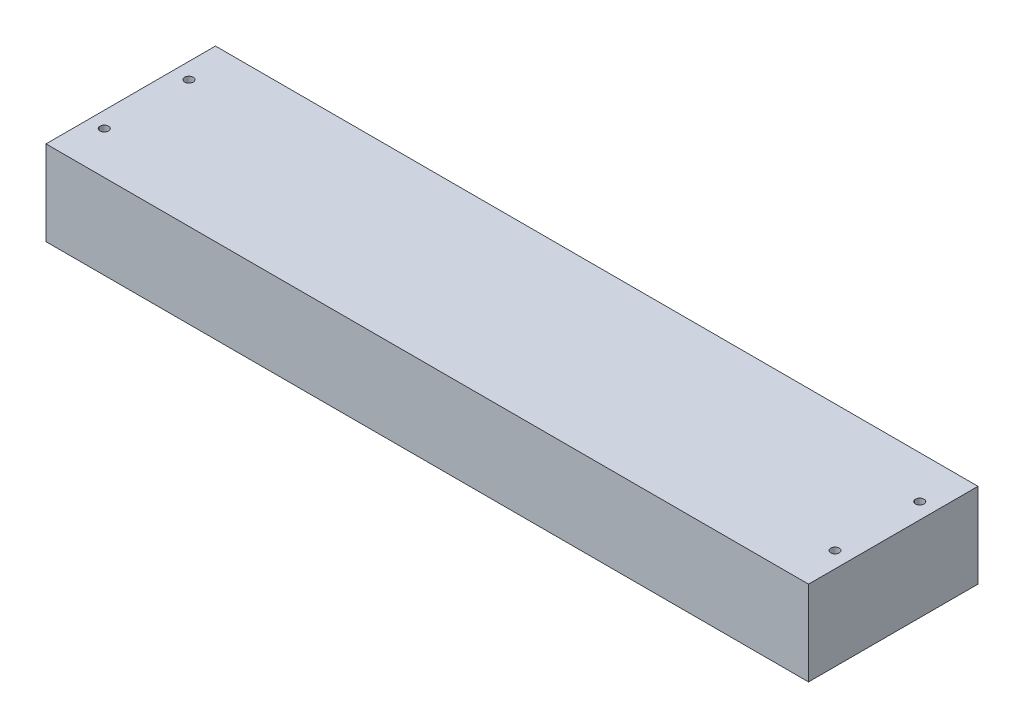
ISO-10303-21;
HEADER;
FILE_DESCRIPTION(('STEP AP214'),'2;1');
FILE_NAME('part.step','',(''),(''),'','','');
FILE_SCHEMA(('AUTOMOTIVE_DESIGN { 1 0 10303 214 1 1 1 1 }'));
ENDSEC;
DATA;
#1=APPLICATION_CONTEXT('core data for automotive mechanical design processes');
#2=APPLICATION_PROTOCOL_DEFINITION('international standard','automotive_design',2000,#1);
#3=PRODUCT_CONTEXT('',#1,'mechanical');
#4=PRODUCT('Part','Part','',(#3));
#5=PRODUCT_RELATED_PRODUCT_CATEGORY('part','',(#4));
#6=PRODUCT_DEFINITION_FORMATION('','',#4);
#7=PRODUCT_DEFINITION_CONTEXT('part definition',#1,'design');
#8=PRODUCT_DEFINITION('design','',#6,#7);
#9=PRODUCT_DEFINITION_SHAPE('','',#8);
#10=(LENGTH_UNIT() NAMED_UNIT(*) SI_UNIT(.MILLI.,.METRE.));
#11=(NAMED_UNIT(*) PLANE_ANGLE_UNIT() SI_UNIT($,.RADIAN.));
#12=(NAMED_UNIT(*) SI_UNIT($,.STERADIAN.) SOLID_ANGLE_UNIT());
#13=UNCERTAINTY_MEASURE_WITH_UNIT(LENGTH_MEASURE(1.E-05),#10,'distance_accuracy_value','');
#14=(GEOMETRIC_REPRESENTATION_CONTEXT(3) GLOBAL_UNCERTAINTY_ASSIGNED_CONTEXT((#13)) GLOBAL_UNIT_ASSIGNED_CONTEXT((#10,
#11,#12)) REPRESENTATION_CONTEXT('',''));
#15=CARTESIAN_POINT('',(0.,0.,0.));
#16=DIRECTION('',(0.,0.,1.));
#17=DIRECTION('',(1.,0.,0.));
#18=AXIS2_PLACEMENT_3D('',#15,#16,#17);
#19=CARTESIAN_POINT('',(457.2,25.4,-50.8));
#20=DIRECTION('',(0.,0.,1.));
#21=DIRECTION('',(1.,0.,0.));
#22=AXIS2_PLACEMENT_3D('',#19,#20,#21);
#23=PLANE('',#22);
#24=DIRECTION('',(0.,1.,0.));
#25=VECTOR('',#24,1.);
#26=CARTESIAN_POINT('',(0.,25.4,-50.8));
#27=LINE('',#26,#25);
#28=CARTESIAN_POINT('',(0.,-25.4,-50.8));
#29=VERTEX_POINT('',#28);
#30=CARTESIAN_POINT('',(0.,25.4,-50.8));
#31=VERTEX_POINT('',#30);
#32=EDGE_CURVE('E99',#29,#31,#27,.T.);
#33=ORIENTED_EDGE('',*,*,#32,.T.);
#34=DIRECTION('',(-1.,0.,0.));
#35=VECTOR('',#34,1.);
#36=CARTESIAN_POINT('',(457.2,25.4,-50.8));
#37=LINE('',#36,#35);
#38=CARTESIAN_POINT('',(457.2,25.4,-50.8));
#39=VERTEX_POINT('',#38);
#40=EDGE_CURVE('E11',#39,#31,#37,.T.);
#41=ORIENTED_EDGE('',*,*,#40,.F.);
#42=DIRECTION('',(0.,1.,0.));
#43=VECTOR('',#42,1.);
#44=CARTESIAN_POINT('',(457.2,25.4,-50.8));
#45=LINE('',#44,#43);
#46=CARTESIAN_POINT('',(457.2,-25.4,-50.8));
#47=VERTEX_POINT('',#46);
#48=EDGE_CURVE('E87',#47,#39,#45,.T.);
#49=ORIENTED_EDGE('',*,*,#48,.F.);
#50=DIRECTION('',(-1.,0.,0.));
#51=VECTOR('',#50,1.);
#52=CARTESIAN_POINT('',(457.2,-25.4,-50.8));
#53=LINE('',#52,#51);
#54=EDGE_CURVE('E95',#47,#29,#53,.T.);
#55=ORIENTED_EDGE('',*,*,#54,.T.);
#56=EDGE_LOOP('',(#33,#41,#49,#55));
#57=FACE_BOUND('',#56,.T.);
#58=ADVANCED_FACE('F36',(#57),#23,.F.);
#59=CARTESIAN_POINT('',(457.2,25.4,50.8));
#60=DIRECTION('',(0.,-1.,0.));
#61=DIRECTION('',(0.,0.,-1.));
#62=AXIS2_PLACEMENT_3D('',#59,#60,#61);
#63=PLANE('',#62);
#64=CARTESIAN_POINT('',(447.675,25.4,-25.4));
#65=DIRECTION('',(0.,-1.,0.));
#66=DIRECTION('',(0.,0.,1.));
#67=AXIS2_PLACEMENT_3D('',#64,#65,#66);
#68=CIRCLE('',#67,2.5527);
#69=CARTESIAN_POINT('',(447.675,25.4,-22.8473));
#70=VERTEX_POINT('',#69);
#71=EDGE_CURVE('E128',#70,#70,#68,.T.);
#72=ORIENTED_EDGE('',*,*,#71,.T.);
#73=EDGE_LOOP('',(#72));
#74=FACE_BOUND('',#73,.T.);
#75=CARTESIAN_POINT('',(447.675,25.4,25.4));
#76=DIRECTION('',(0.,-1.,0.));
#77=DIRECTION('',(0.,0.,1.));
#78=AXIS2_PLACEMENT_3D('',#75,#76,#77);
#79=CIRCLE('',#78,2.5527);
#80=CARTESIAN_POINT('',(447.675,25.4,27.9527));
#81=VERTEX_POINT('',#80);
#82=EDGE_CURVE('E129',#81,#81,#79,.T.);
#83=ORIENTED_EDGE('',*,*,#82,.T.);
#84=EDGE_LOOP('',(#83));
#85=FACE_BOUND('',#84,.T.);
#86=CARTESIAN_POINT('',(9.52500000000001,25.4,-25.4));
#87=DIRECTION('',(0.,1.,0.));
#88=DIRECTION('',(0.,0.,1.));
#89=AXIS2_PLACEMENT_3D('',#86,#87,#88);
#90=CIRCLE('',#89,2.5527);
#91=CARTESIAN_POINT('',(9.52500000000001,25.4,-22.8473));
#92=VERTEX_POINT('',#91);
#93=EDGE_CURVE('E116',#92,#92,#90,.T.);
#94=ORIENTED_EDGE('',*,*,#93,.F.);
#95=EDGE_LOOP('',(#94));
#96=FACE_BOUND('',#95,.T.);
#97=CARTESIAN_POINT('',(9.52500000000001,25.4,25.4));
#98=DIRECTION('',(0.,1.,0.));
#99=DIRECTION('',(0.,0.,1.));
#100=AXIS2_PLACEMENT_3D('',#97,#98,#99);
#101=CIRCLE('',#100,2.5527);
#102=CARTESIAN_POINT('',(9.52500000000001,25.4,27.9527));
#103=VERTEX_POINT('',#102);
#104=EDGE_CURVE('E117',#103,#103,#101,.T.);
#105=ORIENTED_EDGE('',*,*,#104,.F.);
#106=EDGE_LOOP('',(#105));
#107=FACE_BOUND('',#106,.T.);
#108=DIRECTION('',(0.,0.,1.));
#109=VECTOR('',#108,1.);
#110=CARTESIAN_POINT('',(0.,25.4,50.8));
#111=LINE('',#110,#109);
#112=CARTESIAN_POINT('',(0.,25.4,50.8));
#113=VERTEX_POINT('',#112);
#114=EDGE_CURVE('E91',#31,#113,#111,.T.);
#115=ORIENTED_EDGE('',*,*,#114,.T.);
#116=DIRECTION('',(-1.,0.,0.));
#117=VECTOR('',#116,1.);
#118=CARTESIAN_POINT('',(457.2,25.4,50.8));
#119=LINE('',#118,#117);
#120=CARTESIAN_POINT('',(457.2,25.4,50.8));
#121=VERTEX_POINT('',#120);
#122=EDGE_CURVE('E44',#121,#113,#119,.T.);
#123=ORIENTED_EDGE('',*,*,#122,.F.);
#124=DIRECTION('',(0.,0.,1.));
#125=VECTOR('',#124,1.);
#126=CARTESIAN_POINT('',(457.2,25.4,50.8));
#127=LINE('',#126,#125);
#128=EDGE_CURVE('E82',#39,#121,#127,.T.);
#129=ORIENTED_EDGE('',*,*,#128,.F.);
#130=ORIENTED_EDGE('',*,*,#40,.T.);
#131=EDGE_LOOP('',(#115,#123,#129,#130));
#132=FACE_BOUND('',#131,.T.);
#133=ADVANCED_FACE('F90',(#74,#85,#96,#107,#132),#63,.F.);
#134=CARTESIAN_POINT('',(457.2,25.4,50.8));
#135=DIRECTION('',(0.,0.,-1.));
#136=DIRECTION('',(-1.,0.,0.));
#137=AXIS2_PLACEMENT_3D('',#134,#135,#136);
#138=PLANE('',#137);
#139=DIRECTION('',(0.,-1.,0.));
#140=VECTOR('',#139,1.);
#141=CARTESIAN_POINT('',(0.,25.4,50.8));
#142=LINE('',#141,#140);
#143=CARTESIAN_POINT('',(0.,-25.4,50.8));
#144=VERTEX_POINT('',#143);
#145=EDGE_CURVE('E69',#113,#144,#142,.T.);
#146=ORIENTED_EDGE('',*,*,#145,.T.);
#147=DIRECTION('',(-1.,0.,0.));
#148=VECTOR('',#147,1.);
#149=CARTESIAN_POINT('',(457.2,-25.4,50.8));
#150=LINE('',#149,#148);
#151=CARTESIAN_POINT('',(457.2,-25.4,50.8));
#152=VERTEX_POINT('',#151);
#153=EDGE_CURVE('E92',#152,#144,#150,.T.);
#154=ORIENTED_EDGE('',*,*,#153,.F.);
#155=DIRECTION('',(0.,-1.,0.));
#156=VECTOR('',#155,1.);
#157=CARTESIAN_POINT('',(457.2,25.4,50.8));
#158=LINE('',#157,#156);
#159=EDGE_CURVE('E85',#121,#152,#158,.T.);
#160=ORIENTED_EDGE('',*,*,#159,.F.);
#161=ORIENTED_EDGE('',*,*,#122,.T.);
#162=EDGE_LOOP('',(#146,#154,#160,#161));
#163=FACE_BOUND('',#162,.T.);
#164=ADVANCED_FACE('F93',(#163),#138,.F.);
#165=CARTESIAN_POINT('',(457.2,-25.4,50.8));
#166=DIRECTION('',(0.,1.,0.));
#167=DIRECTION('',(0.,0.,1.));
#168=AXIS2_PLACEMENT_3D('',#165,#166,#167);
#169=PLANE('',#168);
#170=CARTESIAN_POINT('',(447.675,-25.4,-25.4));
#171=DIRECTION('',(0.,1.,0.));
#172=DIRECTION('',(0.,0.,1.));
#173=AXIS2_PLACEMENT_3D('',#170,#171,#172);
#174=CIRCLE('',#173,2.5527);
#175=CARTESIAN_POINT('',(447.675,-25.4,-22.8473));
#176=VERTEX_POINT('',#175);
#177=EDGE_CURVE('E120',#176,#176,#174,.T.);
#178=ORIENTED_EDGE('',*,*,#177,.T.);
#179=EDGE_LOOP('',(#178));
#180=FACE_BOUND('',#179,.T.);
#181=CARTESIAN_POINT('',(447.675,-25.4,25.4));
#182=DIRECTION('',(0.,1.,0.));
#183=DIRECTION('',(0.,0.,1.));
#184=AXIS2_PLACEMENT_3D('',#181,#182,#183);
#185=CIRCLE('',#184,2.5527);
#186=CARTESIAN_POINT('',(447.675,-25.4,27.9527));
#187=VERTEX_POINT('',#186);
#188=EDGE_CURVE('E125',#187,#187,#185,.T.);
#189=ORIENTED_EDGE('',*,*,#188,.T.);
#190=EDGE_LOOP('',(#189));
#191=FACE_BOUND('',#190,.T.);
#192=CARTESIAN_POINT('',(9.52500000000001,-25.4,-25.4));
#193=DIRECTION('',(0.,1.,0.));
#194=DIRECTION('',(0.,0.,1.));
#195=AXIS2_PLACEMENT_3D('',#192,#193,#194);
#196=CIRCLE('',#195,2.5527);
#197=CARTESIAN_POINT('',(9.52500000000001,-25.4,-22.8473));
#198=VERTEX_POINT('',#197);
#199=EDGE_CURVE('E102',#198,#198,#196,.F.);
#200=ORIENTED_EDGE('',*,*,#199,.F.);
#201=EDGE_LOOP('',(#200));
#202=FACE_BOUND('',#201,.T.);
#203=CARTESIAN_POINT('',(9.52500000000001,-25.4,25.4));
#204=DIRECTION('',(0.,1.,0.));
#205=DIRECTION('',(0.,0.,1.));
#206=AXIS2_PLACEMENT_3D('',#203,#204,#205);
#207=CIRCLE('',#206,2.5527);
#208=CARTESIAN_POINT('',(9.52500000000001,-25.4,27.9527));
#209=VERTEX_POINT('',#208);
#210=EDGE_CURVE('E113',#209,#209,#207,.F.);
#211=ORIENTED_EDGE('',*,*,#210,.F.);
#212=EDGE_LOOP('',(#211));
#213=FACE_BOUND('',#212,.T.);
#214=DIRECTION('',(0.,0.,-1.));
#215=VECTOR('',#214,1.);
#216=CARTESIAN_POINT('',(0.,-25.4,50.8));
#217=LINE('',#216,#215);
#218=EDGE_CURVE('E75',#144,#29,#217,.T.);
#219=ORIENTED_EDGE('',*,*,#218,.T.);
#220=ORIENTED_EDGE('',*,*,#54,.F.);
#221=DIRECTION('',(0.,0.,-1.));
#222=VECTOR('',#221,1.);
#223=CARTESIAN_POINT('',(457.2,-25.4,50.8));
#224=LINE('',#223,#222);
#225=EDGE_CURVE('E52',#152,#47,#224,.T.);
#226=ORIENTED_EDGE('',*,*,#225,.F.);
#227=ORIENTED_EDGE('',*,*,#153,.T.);
#228=EDGE_LOOP('',(#219,#220,#226,#227));
#229=FACE_BOUND('',#228,.T.);
#230=ADVANCED_FACE('F107',(#180,#191,#202,#213,#229),#169,.F.);
#231=CARTESIAN_POINT('',(457.2,0.,0.));
#232=DIRECTION('',(1.,0.,0.));
#233=DIRECTION('',(0.,0.,-1.));
#234=AXIS2_PLACEMENT_3D('',#231,#232,#233);
#235=PLANE('',#234);
#236=ORIENTED_EDGE('',*,*,#48,.T.);
#237=ORIENTED_EDGE('',*,*,#128,.T.);
#238=ORIENTED_EDGE('',*,*,#159,.T.);
#239=ORIENTED_EDGE('',*,*,#225,.T.);
#240=EDGE_LOOP('',(#236,#237,#238,#239));
#241=FACE_BOUND('',#240,.T.);
#242=ADVANCED_FACE('F83',(#241),#235,.T.);
#243=CARTESIAN_POINT('',(0.,0.,0.));
#244=DIRECTION('',(1.,0.,0.));
#245=DIRECTION('',(0.,0.,-1.));
#246=AXIS2_PLACEMENT_3D('',#243,#244,#245);
#247=PLANE('',#246);
#248=ORIENTED_EDGE('',*,*,#32,.F.);
#249=ORIENTED_EDGE('',*,*,#218,.F.);
#250=ORIENTED_EDGE('',*,*,#145,.F.);
#251=ORIENTED_EDGE('',*,*,#114,.F.);
#252=EDGE_LOOP('',(#248,#249,#250,#251));
#253=FACE_BOUND('',#252,.T.);
#254=ADVANCED_FACE('F110',(#253),#247,.F.);
#255=CARTESIAN_POINT('',(9.52500000000001,-32.6201259213396,25.4));
#256=DIRECTION('',(0.,1.,0.));
#257=DIRECTION('',(0.,0.,1.));
#258=AXIS2_PLACEMENT_3D('',#255,#256,#257);
#259=CYLINDRICAL_SURFACE('',#258,2.5527);
#260=ORIENTED_EDGE('',*,*,#210,.T.);
#261=EDGE_LOOP('',(#260));
#262=FACE_BOUND('',#261,.T.);
#263=ORIENTED_EDGE('',*,*,#104,.T.);
#264=EDGE_LOOP('',(#263));
#265=FACE_BOUND('',#264,.T.);
#266=ADVANCED_FACE('F165',(#262,#265),#259,.F.);
#267=CARTESIAN_POINT('',(9.52500000000001,-32.6201259213396,-25.4));
#268=DIRECTION('',(0.,1.,0.));
#269=DIRECTION('',(0.,0.,1.));
#270=AXIS2_PLACEMENT_3D('',#267,#268,#269);
#271=CYLINDRICAL_SURFACE('',#270,2.5527);
#272=ORIENTED_EDGE('',*,*,#199,.T.);
#273=EDGE_LOOP('',(#272));
#274=FACE_BOUND('',#273,.T.);
#275=ORIENTED_EDGE('',*,*,#93,.T.);
#276=EDGE_LOOP('',(#275));
#277=FACE_BOUND('',#276,.T.);
#278=ADVANCED_FACE('F147',(#274,#277),#271,.F.);
#279=CARTESIAN_POINT('',(447.675,-32.6201259213396,25.4));
#280=DIRECTION('',(0.,1.,0.));
#281=DIRECTION('',(0.,0.,1.));
#282=AXIS2_PLACEMENT_3D('',#279,#280,#281);
#283=CYLINDRICAL_SURFACE('',#282,2.5527);
#284=CARTESIAN_POINT('',(447.675,-25.4,27.9527));
#285=CARTESIAN_POINT('',(447.675,-24.8708333333333,27.9527));
#286=CARTESIAN_POINT('',(447.675,-24.3416666666667,27.9527));
#287=CARTESIAN_POINT('',(447.675,-23.2833333333333,27.9527));
#288=CARTESIAN_POINT('',(447.675,-22.7541666666667,27.9527));
#289=CARTESIAN_POINT('',(447.675,-21.6958333333333,27.9527));
#290=CARTESIAN_POINT('',(447.675,-21.1666666666667,27.9527));
#291=CARTESIAN_POINT('',(447.675,-20.1083333333333,27.9527));
#292=CARTESIAN_POINT('',(447.675,-19.5791666666667,27.9527));
#293=CARTESIAN_POINT('',(447.675,-18.5208333333333,27.9527));
#294=CARTESIAN_POINT('',(447.675,-17.9916666666667,27.9527));
#295=CARTESIAN_POINT('',(447.675,-16.9333333333333,27.9527));
#296=CARTESIAN_POINT('',(447.675,-16.4041666666667,27.9527));
#297=CARTESIAN_POINT('',(447.675,-15.3458333333333,27.9527));
#298=CARTESIAN_POINT('',(447.675,-14.8166666666667,27.9527));
#299=CARTESIAN_POINT('',(447.675,-13.7583333333333,27.9527));
#300=CARTESIAN_POINT('',(447.675,-13.2291666666667,27.9527));
#301=CARTESIAN_POINT('',(447.675,-12.1708333333333,27.9527));
#302=CARTESIAN_POINT('',(447.675,-11.6416666666667,27.9527));
#303=CARTESIAN_POINT('',(447.675,-10.5833333333333,27.9527));
#304=CARTESIAN_POINT('',(447.675,-10.0541666666667,27.9527));
#305=CARTESIAN_POINT('',(447.675,-8.99583333333333,27.9527));
#306=CARTESIAN_POINT('',(447.675,-8.46666666666667,27.9527));
#307=CARTESIAN_POINT('',(447.675,-7.40833333333333,27.9527));
#308=CARTESIAN_POINT('',(447.675,-6.87916666666666,27.9527));
#309=CARTESIAN_POINT('',(447.675,-5.82083333333333,27.9527));
#310=CARTESIAN_POINT('',(447.675,-5.29166666666667,27.9527));
#311=CARTESIAN_POINT('',(447.675,-4.23333333333333,27.9527));
#312=CARTESIAN_POINT('',(447.675,-3.70416666666667,27.9527));
#313=CARTESIAN_POINT('',(447.675,-2.64583333333333,27.9527));
#314=CARTESIAN_POINT('',(447.675,-2.11666666666666,27.9527));
#315=CARTESIAN_POINT('',(447.675,-1.05833333333333,27.9527));
#316=CARTESIAN_POINT('',(447.675,-0.529166666666665,27.9527));
#317=CARTESIAN_POINT('',(447.675,0.529166666666666,27.9527));
#318=CARTESIAN_POINT('',(447.675,1.05833333333333,27.9527));
#319=CARTESIAN_POINT('',(447.675,2.11666666666666,27.9527));
#320=CARTESIAN_POINT('',(447.675,2.64583333333333,27.9527));
#321=CARTESIAN_POINT('',(447.675,3.70416666666667,27.9527));
#322=CARTESIAN_POINT('',(447.675,4.23333333333333,27.9527));
#323=CARTESIAN_POINT('',(447.675,5.29166666666667,27.9527));
#324=CARTESIAN_POINT('',(447.675,5.82083333333333,27.9527));
#325=CARTESIAN_POINT('',(447.675,6.87916666666667,27.9527));
#326=CARTESIAN_POINT('',(447.675,7.40833333333333,27.9527));
#327=CARTESIAN_POINT('',(447.675,8.46666666666667,27.9527));
#328=CARTESIAN_POINT('',(447.675,8.99583333333334,27.9527));
#329=CARTESIAN_POINT('',(447.675,10.0541666666667,27.9527));
#330=CARTESIAN_POINT('',(447.675,10.5833333333333,27.9527));
#331=CARTESIAN_POINT('',(447.675,11.6416666666667,27.9527));
#332=CARTESIAN_POINT('',(447.675,12.1708333333333,27.9527));
#333=CARTESIAN_POINT('',(447.675,13.2291666666667,27.9527));
#334=CARTESIAN_POINT('',(447.675,13.7583333333333,27.9527));
#335=CARTESIAN_POINT('',(447.675,14.8166666666667,27.9527));
#336=CARTESIAN_POINT('',(447.675,15.3458333333333,27.9527));
#337=CARTESIAN_POINT('',(447.675,16.4041666666667,27.9527));
#338=CARTESIAN_POINT('',(447.675,16.9333333333333,27.9527));
#339=CARTESIAN_POINT('',(447.675,17.9916666666667,27.9527));
#340=CARTESIAN_POINT('',(447.675,18.5208333333333,27.9527));
#341=CARTESIAN_POINT('',(447.675,19.5791666666667,27.9527));
#342=CARTESIAN_POINT('',(447.675,20.1083333333333,27.9527));
#343=CARTESIAN_POINT('',(447.675,21.1666666666667,27.9527));
#344=CARTESIAN_POINT('',(447.675,21.6958333333333,27.9527));
#345=CARTESIAN_POINT('',(447.675,22.7541666666667,27.9527));
#346=CARTESIAN_POINT('',(447.675,23.2833333333333,27.9527));
#347=CARTESIAN_POINT('',(447.675,24.3416666666667,27.9527));
#348=CARTESIAN_POINT('',(447.675,24.8708333333333,27.9527));
#349=CARTESIAN_POINT('',(447.675,25.4,27.9527));
#350=B_SPLINE_CURVE_WITH_KNOTS('',3,(#284,#285,#286,#287,#288,#289,#290,#291,#292,#293,#294,
#295,#296,#297,#298,#299,#300,#301,#302,#303,#304,#305,#306,#307,#308,#309,#310,#311,#312,#313,
#314,#315,#316,#317,#318,#319,#320,#321,#322,#323,#324,#325,#326,#327,#328,#329,#330,#331,#332,
#333,#334,#335,#336,#337,#338,#339,#340,#341,#342,#343,#344,#345,#346,#347,#348,#349),
.UNSPECIFIED.,.F.,.F.,(4,2,2,2,2,2,2,2,2,2,2,2,2,2,2,2,2,2,2,2,2,2,2,2,2,2,2,2,2,2,2,2,4),(0.,
1.5875,3.175,4.7625,6.35,7.9375,9.525,11.1125,12.7,14.2875,15.875,17.4625,19.05,20.6375,22.225,
23.8125,25.4,26.9875,28.575,30.1625,31.75,33.3375,34.925,36.5125,38.1,39.6875,41.275,42.8625,
44.45,46.0375,47.625,49.2125,50.8),.UNSPECIFIED.);
#351=EDGE_CURVE('BSEAM141',#187,#81,#350,.T.);
#352=ORIENTED_EDGE('',*,*,#188,.F.);
#353=ORIENTED_EDGE('',*,*,#82,.F.);
#354=ORIENTED_EDGE('',*,*,#351,.T.);
#355=ORIENTED_EDGE('',*,*,#351,.F.);
#356=EDGE_LOOP('',(#352,#354,#353,#355));
#357=FACE_BOUND('',#356,.T.);
#358=ADVANCED_FACE('F141',(#357),#283,.F.);
#359=CARTESIAN_POINT('',(447.675,-32.6201259213396,-25.4));
#360=DIRECTION('',(0.,1.,0.));
#361=DIRECTION('',(0.,0.,1.));
#362=AXIS2_PLACEMENT_3D('',#359,#360,#361);
#363=CYLINDRICAL_SURFACE('',#362,2.5527);
#364=CARTESIAN_POINT('',(447.675,-25.4,-22.8473));
#365=CARTESIAN_POINT('',(447.675,-24.8708333333333,-22.8473));
#366=CARTESIAN_POINT('',(447.675,-24.3416666666667,-22.8473));
#367=CARTESIAN_POINT('',(447.675,-23.2833333333333,-22.8473));
#368=CARTESIAN_POINT('',(447.675,-22.7541666666667,-22.8473));
#369=CARTESIAN_POINT('',(447.675,-21.6958333333333,-22.8473));
#370=CARTESIAN_POINT('',(447.675,-21.1666666666667,-22.8473));
#371=CARTESIAN_POINT('',(447.675,-20.1083333333333,-22.8473));
#372=CARTESIAN_POINT('',(447.675,-19.5791666666667,-22.8473));
#373=CARTESIAN_POINT('',(447.675,-18.5208333333333,-22.8473));
#374=CARTESIAN_POINT('',(447.675,-17.9916666666667,-22.8473));
#375=CARTESIAN_POINT('',(447.675,-16.9333333333333,-22.8473));
#376=CARTESIAN_POINT('',(447.675,-16.4041666666667,-22.8473));
#377=CARTESIAN_POINT('',(447.675,-15.3458333333333,-22.8473));
#378=CARTESIAN_POINT('',(447.675,-14.8166666666667,-22.8473));
#379=CARTESIAN_POINT('',(447.675,-13.7583333333333,-22.8473));
#380=CARTESIAN_POINT('',(447.675,-13.2291666666667,-22.8473));
#381=CARTESIAN_POINT('',(447.675,-12.1708333333333,-22.8473));
#382=CARTESIAN_POINT('',(447.675,-11.6416666666667,-22.8473));
#383=CARTESIAN_POINT('',(447.675,-10.5833333333333,-22.8473));
#384=CARTESIAN_POINT('',(447.675,-10.0541666666667,-22.8473));
#385=CARTESIAN_POINT('',(447.675,-8.99583333333333,-22.8473));
#386=CARTESIAN_POINT('',(447.675,-8.46666666666667,-22.8473));
#387=CARTESIAN_POINT('',(447.675,-7.40833333333333,-22.8473));
#388=CARTESIAN_POINT('',(447.675,-6.87916666666666,-22.8473));
#389=CARTESIAN_POINT('',(447.675,-5.82083333333333,-22.8473));
#390=CARTESIAN_POINT('',(447.675,-5.29166666666667,-22.8473));
#391=CARTESIAN_POINT('',(447.675,-4.23333333333333,-22.8473));
#392=CARTESIAN_POINT('',(447.675,-3.70416666666667,-22.8473));
#393=CARTESIAN_POINT('',(447.675,-2.64583333333333,-22.8473));
#394=CARTESIAN_POINT('',(447.675,-2.11666666666666,-22.8473));
#395=CARTESIAN_POINT('',(447.675,-1.05833333333333,-22.8473));
#396=CARTESIAN_POINT('',(447.675,-0.529166666666665,-22.8473));
#397=CARTESIAN_POINT('',(447.675,0.529166666666666,-22.8473));
#398=CARTESIAN_POINT('',(447.675,1.05833333333333,-22.8473));
#399=CARTESIAN_POINT('',(447.675,2.11666666666666,-22.8473));
#400=CARTESIAN_POINT('',(447.675,2.64583333333333,-22.8473));
#401=CARTESIAN_POINT('',(447.675,3.70416666666667,-22.8473));
#402=CARTESIAN_POINT('',(447.675,4.23333333333333,-22.8473));
#403=CARTESIAN_POINT('',(447.675,5.29166666666667,-22.8473));
#404=CARTESIAN_POINT('',(447.675,5.82083333333333,-22.8473));
#405=CARTESIAN_POINT('',(447.675,6.87916666666667,-22.8473));
#406=CARTESIAN_POINT('',(447.675,7.40833333333333,-22.8473));
#407=CARTESIAN_POINT('',(447.675,8.46666666666667,-22.8473));
#408=CARTESIAN_POINT('',(447.675,8.99583333333334,-22.8473));
#409=CARTESIAN_POINT('',(447.675,10.0541666666667,-22.8473));
#410=CARTESIAN_POINT('',(447.675,10.5833333333333,-22.8473));
#411=CARTESIAN_POINT('',(447.675,11.6416666666667,-22.8473));
#412=CARTESIAN_POINT('',(447.675,12.1708333333333,-22.8473));
#413=CARTESIAN_POINT('',(447.675,13.2291666666667,-22.8473));
#414=CARTESIAN_POINT('',(447.675,13.7583333333333,-22.8473));
#415=CARTESIAN_POINT('',(447.675,14.8166666666667,-22.8473));
#416=CARTESIAN_POINT('',(447.675,15.3458333333333,-22.8473));
#417=CARTESIAN_POINT('',(447.675,16.4041666666667,-22.8473));
#418=CARTESIAN_POINT('',(447.675,16.9333333333333,-22.8473));
#419=CARTESIAN_POINT('',(447.675,17.9916666666667,-22.8473));
#420=CARTESIAN_POINT('',(447.675,18.5208333333333,-22.8473));
#421=CARTESIAN_POINT('',(447.675,19.5791666666667,-22.8473));
#422=CARTESIAN_POINT('',(447.675,20.1083333333333,-22.8473));
#423=CARTESIAN_POINT('',(447.675,21.1666666666667,-22.8473));
#424=CARTESIAN_POINT('',(447.675,21.6958333333333,-22.8473));
#425=CARTESIAN_POINT('',(447.675,22.7541666666667,-22.8473));
#426=CARTESIAN_POINT('',(447.675,23.2833333333333,-22.8473));
#427=CARTESIAN_POINT('',(447.675,24.3416666666667,-22.8473));
#428=CARTESIAN_POINT('',(447.675,24.8708333333333,-22.8473));
#429=CARTESIAN_POINT('',(447.675,25.4,-22.8473));
#430=B_SPLINE_CURVE_WITH_KNOTS('',3,(#364,#365,#366,#367,#368,#369,#370,#371,#372,#373,#374,
#375,#376,#377,#378,#379,#380,#381,#382,#383,#384,#385,#386,#387,#388,#389,#390,#391,#392,#393,
#394,#395,#396,#397,#398,#399,#400,#401,#402,#403,#404,#405,#406,#407,#408,#409,#410,#411,#412,
#413,#414,#415,#416,#417,#418,#419,#420,#421,#422,#423,#424,#425,#426,#427,#428,#429),
.UNSPECIFIED.,.F.,.F.,(4,2,2,2,2,2,2,2,2,2,2,2,2,2,2,2,2,2,2,2,2,2,2,2,2,2,2,2,2,2,2,2,4),(0.,
1.5875,3.175,4.7625,6.35,7.9375,9.525,11.1125,12.7,14.2875,15.875,17.4625,19.05,20.6375,22.225,
23.8125,25.4,26.9875,28.575,30.1625,31.75,33.3375,34.925,36.5125,38.1,39.6875,41.275,42.8625,
44.45,46.0375,47.625,49.2125,50.8),.UNSPECIFIED.);
#431=EDGE_CURVE('BSEAM139',#176,#70,#430,.T.);
#432=ORIENTED_EDGE('',*,*,#177,.F.);
#433=ORIENTED_EDGE('',*,*,#71,.F.);
#434=ORIENTED_EDGE('',*,*,#431,.T.);
#435=ORIENTED_EDGE('',*,*,#431,.F.);
#436=EDGE_LOOP('',(#432,#434,#433,#435));
#437=FACE_BOUND('',#436,.T.);
#438=ADVANCED_FACE('F139',(#437),#363,.F.);
#439=CLOSED_SHELL('',(#58,#133,#164,#230,#242,#254,#266,#278,#358,#438));
#440=MANIFOLD_SOLID_BREP('B2',#439);
#441=ADVANCED_BREP_SHAPE_REPRESENTATION('',(#18,#440),#14);
#442=SHAPE_DEFINITION_REPRESENTATION(#9,#441);
ENDSEC;
END-ISO-10303-21;
